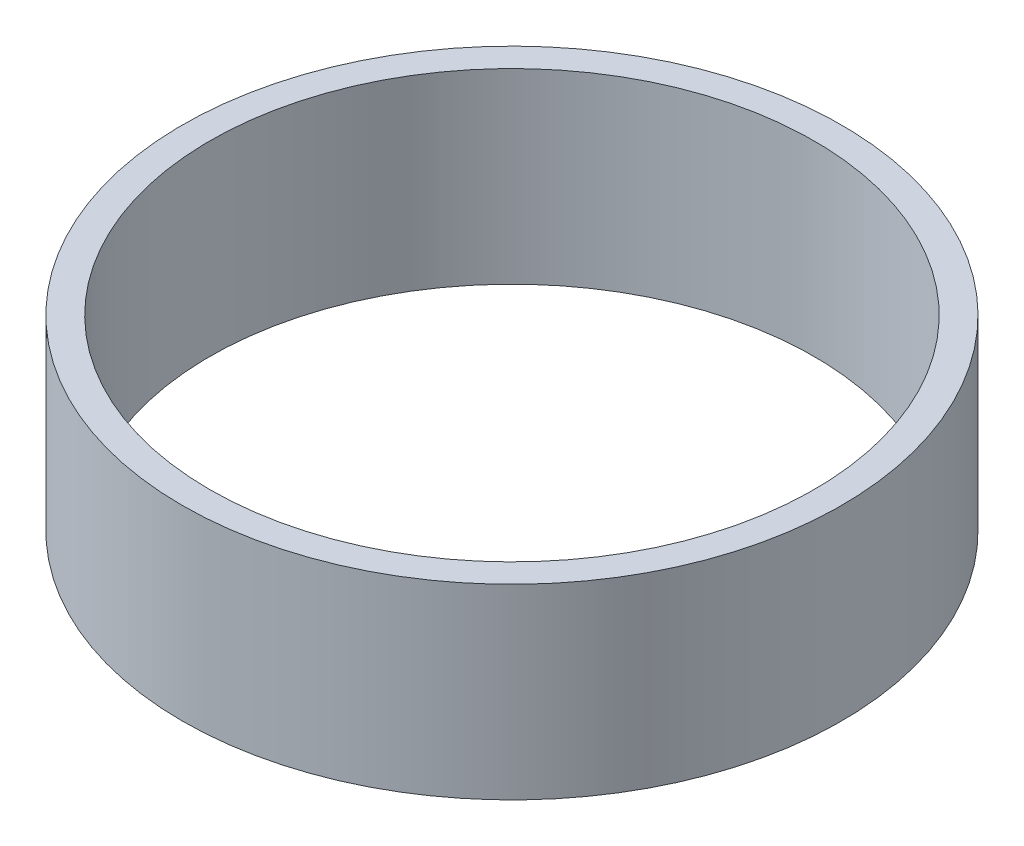
ISO-10303-21;
HEADER;
FILE_DESCRIPTION(('STEP AP214'),'2;1');
FILE_NAME('part.step','',(''),(''),'','','');
FILE_SCHEMA(('AUTOMOTIVE_DESIGN { 1 0 10303 214 1 1 1 1 }'));
ENDSEC;
DATA;
#1=APPLICATION_CONTEXT('core data for automotive mechanical design processes');
#2=APPLICATION_PROTOCOL_DEFINITION('international standard','automotive_design',2000,#1);
#3=PRODUCT_CONTEXT('',#1,'mechanical');
#4=PRODUCT('Part','Part','',(#3));
#5=PRODUCT_RELATED_PRODUCT_CATEGORY('part','',(#4));
#6=PRODUCT_DEFINITION_FORMATION('','',#4);
#7=PRODUCT_DEFINITION_CONTEXT('part definition',#1,'design');
#8=PRODUCT_DEFINITION('design','',#6,#7);
#9=PRODUCT_DEFINITION_SHAPE('','',#8);
#10=(LENGTH_UNIT() NAMED_UNIT(*) SI_UNIT(.MILLI.,.METRE.));
#11=(NAMED_UNIT(*) PLANE_ANGLE_UNIT() SI_UNIT($,.RADIAN.));
#12=(NAMED_UNIT(*) SI_UNIT($,.STERADIAN.) SOLID_ANGLE_UNIT());
#13=UNCERTAINTY_MEASURE_WITH_UNIT(LENGTH_MEASURE(1.E-05),#10,'distance_accuracy_value','');
#14=(GEOMETRIC_REPRESENTATION_CONTEXT(3) GLOBAL_UNCERTAINTY_ASSIGNED_CONTEXT((#13)) GLOBAL_UNIT_ASSIGNED_CONTEXT((#10,
#11,#12)) REPRESENTATION_CONTEXT('',''));
#15=CARTESIAN_POINT('',(0.,0.,0.));
#16=DIRECTION('',(0.,0.,1.));
#17=DIRECTION('',(1.,0.,0.));
#18=AXIS2_PLACEMENT_3D('',#15,#16,#17);
#19=CARTESIAN_POINT('',(0.,17.,0.));
#20=DIRECTION('',(0.,1.,0.));
#21=DIRECTION('',(0.,0.,1.));
#22=AXIS2_PLACEMENT_3D('',#19,#20,#21);
#23=PLANE('',#22);
#24=CARTESIAN_POINT('',(0.,17.,0.));
#25=DIRECTION('',(0.,1.,0.));
#26=DIRECTION('',(0.,0.,1.));
#27=AXIS2_PLACEMENT_3D('',#24,#25,#26);
#28=CIRCLE('',#27,60.);
#29=CARTESIAN_POINT('',(0.,17.,60.));
#30=VERTEX_POINT('',#29);
#31=EDGE_CURVE('E10',#30,#30,#28,.T.);
#32=ORIENTED_EDGE('',*,*,#31,.T.);
#33=EDGE_LOOP('',(#32));
#34=FACE_BOUND('',#33,.T.);
#35=CARTESIAN_POINT('',(0.,17.,0.));
#36=DIRECTION('',(0.,1.,0.));
#37=DIRECTION('',(0.,0.,1.));
#38=AXIS2_PLACEMENT_3D('',#35,#36,#37);
#39=CIRCLE('',#38,55.);
#40=CARTESIAN_POINT('',(0.,17.,55.));
#41=VERTEX_POINT('',#40);
#42=EDGE_CURVE('E42',#41,#41,#39,.T.);
#43=ORIENTED_EDGE('',*,*,#42,.F.);
#44=EDGE_LOOP('',(#43));
#45=FACE_BOUND('',#44,.T.);
#46=ADVANCED_FACE('F31',(#34,#45),#23,.T.);
#47=CARTESIAN_POINT('',(0.,-17.,0.));
#48=DIRECTION('',(0.,1.,0.));
#49=DIRECTION('',(0.,0.,1.));
#50=AXIS2_PLACEMENT_3D('',#47,#48,#49);
#51=PLANE('',#50);
#52=CARTESIAN_POINT('',(0.,-17.,0.));
#53=DIRECTION('',(0.,1.,0.));
#54=DIRECTION('',(0.,0.,1.));
#55=AXIS2_PLACEMENT_3D('',#52,#53,#54);
#56=CIRCLE('',#55,60.);
#57=CARTESIAN_POINT('',(0.,-17.,60.));
#58=VERTEX_POINT('',#57);
#59=EDGE_CURVE('E35',#58,#58,#56,.T.);
#60=ORIENTED_EDGE('',*,*,#59,.F.);
#61=EDGE_LOOP('',(#60));
#62=FACE_BOUND('',#61,.T.);
#63=CARTESIAN_POINT('',(0.,-17.,0.));
#64=DIRECTION('',(0.,1.,0.));
#65=DIRECTION('',(0.,0.,1.));
#66=AXIS2_PLACEMENT_3D('',#63,#64,#65);
#67=CIRCLE('',#66,55.);
#68=CARTESIAN_POINT('',(0.,-17.,55.));
#69=VERTEX_POINT('',#68);
#70=EDGE_CURVE('E44',#69,#69,#67,.T.);
#71=ORIENTED_EDGE('',*,*,#70,.T.);
#72=EDGE_LOOP('',(#71));
#73=FACE_BOUND('',#72,.T.);
#74=ADVANCED_FACE('F54',(#62,#73),#51,.F.);
#75=CARTESIAN_POINT('',(0.,17.,0.));
#76=DIRECTION('',(0.,-1.,0.));
#77=DIRECTION('',(0.,0.,-1.));
#78=AXIS2_PLACEMENT_3D('',#75,#76,#77);
#79=CYLINDRICAL_SURFACE('',#78,60.);
#80=ORIENTED_EDGE('',*,*,#31,.F.);
#81=EDGE_LOOP('',(#80));
#82=FACE_BOUND('',#81,.T.);
#83=ORIENTED_EDGE('',*,*,#59,.T.);
#84=EDGE_LOOP('',(#83));
#85=FACE_BOUND('',#84,.T.);
#86=ADVANCED_FACE('F33',(#82,#85),#79,.T.);
#87=CARTESIAN_POINT('',(0.,17.,0.));
#88=DIRECTION('',(0.,-1.,0.));
#89=DIRECTION('',(0.,0.,-1.));
#90=AXIS2_PLACEMENT_3D('',#87,#88,#89);
#91=CYLINDRICAL_SURFACE('',#90,55.);
#92=ORIENTED_EDGE('',*,*,#42,.T.);
#93=EDGE_LOOP('',(#92));
#94=FACE_BOUND('',#93,.T.);
#95=ORIENTED_EDGE('',*,*,#70,.F.);
#96=EDGE_LOOP('',(#95));
#97=FACE_BOUND('',#96,.T.);
#98=ADVANCED_FACE('F50',(#94,#97),#91,.F.);
#99=CLOSED_SHELL('',(#46,#74,#86,#98));
#100=MANIFOLD_SOLID_BREP('B2',#99);
#101=ADVANCED_BREP_SHAPE_REPRESENTATION('',(#18,#100),#14);
#102=SHAPE_DEFINITION_REPRESENTATION(#9,#101);
ENDSEC;
END-ISO-10303-21;
